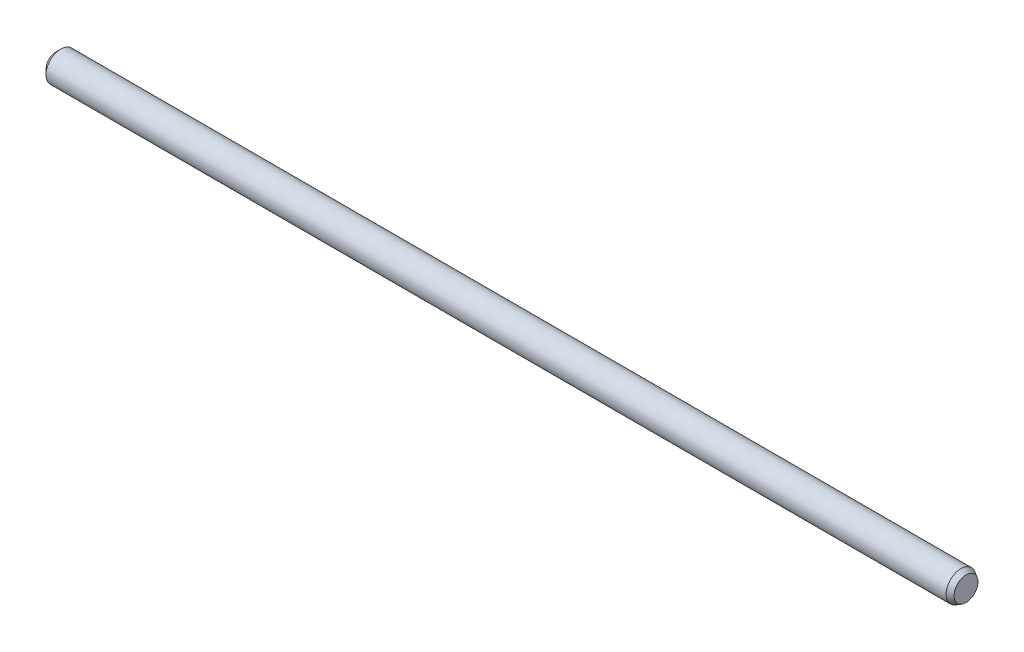
ISO-10303-21;
HEADER;
FILE_DESCRIPTION(('STEP AP214'),'2;1');
FILE_NAME('part.step','',(''),(''),'','','');
FILE_SCHEMA(('AUTOMOTIVE_DESIGN { 1 0 10303 214 1 1 1 1 }'));
ENDSEC;
DATA;
#1=APPLICATION_CONTEXT('core data for automotive mechanical design processes');
#2=APPLICATION_PROTOCOL_DEFINITION('international standard','automotive_design',2000,#1);
#3=PRODUCT_CONTEXT('',#1,'mechanical');
#4=PRODUCT('Part','Part','',(#3));
#5=PRODUCT_RELATED_PRODUCT_CATEGORY('part','',(#4));
#6=PRODUCT_DEFINITION_FORMATION('','',#4);
#7=PRODUCT_DEFINITION_CONTEXT('part definition',#1,'design');
#8=PRODUCT_DEFINITION('design','',#6,#7);
#9=PRODUCT_DEFINITION_SHAPE('','',#8);
#10=(LENGTH_UNIT() NAMED_UNIT(*) SI_UNIT(.MILLI.,.METRE.));
#11=(NAMED_UNIT(*) PLANE_ANGLE_UNIT() SI_UNIT($,.RADIAN.));
#12=(NAMED_UNIT(*) SI_UNIT($,.STERADIAN.) SOLID_ANGLE_UNIT());
#13=UNCERTAINTY_MEASURE_WITH_UNIT(LENGTH_MEASURE(1.E-05),#10,'distance_accuracy_value','');
#14=(GEOMETRIC_REPRESENTATION_CONTEXT(3) GLOBAL_UNCERTAINTY_ASSIGNED_CONTEXT((#13)) GLOBAL_UNIT_ASSIGNED_CONTEXT((#10,
#11,#12)) REPRESENTATION_CONTEXT('',''));
#15=CARTESIAN_POINT('',(0.,0.,0.));
#16=DIRECTION('',(0.,0.,1.));
#17=DIRECTION('',(1.,0.,0.));
#18=AXIS2_PLACEMENT_3D('',#15,#16,#17);
#19=CARTESIAN_POINT('',(90.,0.,0.));
#20=DIRECTION('',(-1.,0.,0.));
#21=DIRECTION('',(0.,0.,1.));
#22=AXIS2_PLACEMENT_3D('',#19,#20,#21);
#23=CYLINDRICAL_SURFACE('',#22,1.475);
#24=CARTESIAN_POINT('',(0.50000000000007,0.,0.));
#25=DIRECTION('',(1.,0.,0.));
#26=DIRECTION('',(0.,0.,-1.));
#27=AXIS2_PLACEMENT_3D('',#24,#25,#26);
#28=CIRCLE('',#27,1.475);
#29=CARTESIAN_POINT('',(0.50000000000007,0.,1.475));
#30=VERTEX_POINT('',#29);
#31=EDGE_CURVE('E40',#30,#30,#28,.T.);
#32=CARTESIAN_POINT('',(89.5,0.,0.));
#33=DIRECTION('',(1.,0.,0.));
#34=DIRECTION('',(0.,0.,-1.));
#35=AXIS2_PLACEMENT_3D('',#32,#33,#34);
#36=CIRCLE('',#35,1.475);
#37=CARTESIAN_POINT('',(89.5,0.,1.475));
#38=VERTEX_POINT('',#37);
#39=EDGE_CURVE('E44',#38,#38,#36,.F.);
#40=CARTESIAN_POINT('',(0.50000000000007,0.,1.475));
#41=CARTESIAN_POINT('',(1.4270833333334,0.,1.475));
#42=CARTESIAN_POINT('',(2.35416666666674,0.,1.475));
#43=CARTESIAN_POINT('',(4.2083333333334,0.,1.475));
#44=CARTESIAN_POINT('',(5.13541666666674,0.,1.475));
#45=CARTESIAN_POINT('',(6.9895833333334,0.,1.475));
#46=CARTESIAN_POINT('',(7.91666666666673,0.,1.475));
#47=CARTESIAN_POINT('',(9.7708333333334,0.,1.475));
#48=CARTESIAN_POINT('',(10.6979166666667,0.,1.475));
#49=CARTESIAN_POINT('',(12.5520833333334,0.,1.475));
#50=CARTESIAN_POINT('',(13.4791666666667,0.,1.475));
#51=CARTESIAN_POINT('',(15.3333333333334,0.,1.475));
#52=CARTESIAN_POINT('',(16.2604166666667,0.,1.475));
#53=CARTESIAN_POINT('',(18.1145833333334,0.,1.475));
#54=CARTESIAN_POINT('',(19.0416666666667,0.,1.475));
#55=CARTESIAN_POINT('',(20.8958333333334,0.,1.475));
#56=CARTESIAN_POINT('',(21.8229166666667,0.,1.475));
#57=CARTESIAN_POINT('',(23.6770833333334,0.,1.475));
#58=CARTESIAN_POINT('',(24.6041666666667,0.,1.475));
#59=CARTESIAN_POINT('',(26.4583333333334,0.,1.475));
#60=CARTESIAN_POINT('',(27.3854166666667,0.,1.475));
#61=CARTESIAN_POINT('',(29.2395833333334,0.,1.475));
#62=CARTESIAN_POINT('',(30.1666666666667,0.,1.475));
#63=CARTESIAN_POINT('',(32.0208333333334,0.,1.475));
#64=CARTESIAN_POINT('',(32.9479166666667,0.,1.475));
#65=CARTESIAN_POINT('',(34.8020833333334,0.,1.475));
#66=CARTESIAN_POINT('',(35.7291666666667,0.,1.475));
#67=CARTESIAN_POINT('',(37.5833333333334,0.,1.475));
#68=CARTESIAN_POINT('',(38.5104166666667,0.,1.475));
#69=CARTESIAN_POINT('',(40.3645833333334,0.,1.475));
#70=CARTESIAN_POINT('',(41.2916666666667,0.,1.475));
#71=CARTESIAN_POINT('',(43.1458333333334,0.,1.475));
#72=CARTESIAN_POINT('',(44.0729166666667,0.,1.475));
#73=CARTESIAN_POINT('',(45.9270833333334,0.,1.475));
#74=CARTESIAN_POINT('',(46.8541666666667,0.,1.475));
#75=CARTESIAN_POINT('',(48.7083333333334,0.,1.475));
#76=CARTESIAN_POINT('',(49.6354166666667,0.,1.475));
#77=CARTESIAN_POINT('',(51.4895833333334,0.,1.475));
#78=CARTESIAN_POINT('',(52.4166666666667,0.,1.475));
#79=CARTESIAN_POINT('',(54.2708333333334,0.,1.475));
#80=CARTESIAN_POINT('',(55.1979166666667,0.,1.475));
#81=CARTESIAN_POINT('',(57.0520833333334,0.,1.475));
#82=CARTESIAN_POINT('',(57.9791666666667,0.,1.475));
#83=CARTESIAN_POINT('',(59.8333333333334,0.,1.475));
#84=CARTESIAN_POINT('',(60.7604166666667,0.,1.475));
#85=CARTESIAN_POINT('',(62.6145833333334,0.,1.475));
#86=CARTESIAN_POINT('',(63.5416666666667,0.,1.475));
#87=CARTESIAN_POINT('',(65.3958333333334,0.,1.475));
#88=CARTESIAN_POINT('',(66.3229166666667,0.,1.475));
#89=CARTESIAN_POINT('',(68.1770833333334,0.,1.475));
#90=CARTESIAN_POINT('',(69.1041666666667,0.,1.475));
#91=CARTESIAN_POINT('',(70.9583333333334,0.,1.475));
#92=CARTESIAN_POINT('',(71.8854166666667,0.,1.475));
#93=CARTESIAN_POINT('',(73.7395833333334,0.,1.475));
#94=CARTESIAN_POINT('',(74.6666666666667,0.,1.475));
#95=CARTESIAN_POINT('',(76.5208333333334,0.,1.475));
#96=CARTESIAN_POINT('',(77.4479166666667,0.,1.475));
#97=CARTESIAN_POINT('',(79.3020833333334,0.,1.475));
#98=CARTESIAN_POINT('',(80.2291666666667,0.,1.475));
#99=CARTESIAN_POINT('',(82.0833333333334,0.,1.475));
#100=CARTESIAN_POINT('',(83.0104166666667,0.,1.475));
#101=CARTESIAN_POINT('',(84.8645833333334,0.,1.475));
#102=CARTESIAN_POINT('',(85.7916666666667,0.,1.475));
#103=CARTESIAN_POINT('',(87.6458333333334,0.,1.475));
#104=CARTESIAN_POINT('',(88.5729166666667,0.,1.475));
#105=CARTESIAN_POINT('',(89.5,0.,1.475));
#106=B_SPLINE_CURVE_WITH_KNOTS('',3,(#40,#41,#42,#43,#44,#45,#46,#47,#48,#49,#50,#51,#52,#53,
#54,#55,#56,#57,#58,#59,#60,#61,#62,#63,#64,#65,#66,#67,#68,#69,#70,#71,#72,#73,#74,#75,#76,#77,
#78,#79,#80,#81,#82,#83,#84,#85,#86,#87,#88,#89,#90,#91,#92,#93,#94,#95,#96,#97,#98,#99,#100,
#101,#102,#103,#104,#105),.UNSPECIFIED.,.F.,.F.,(4,2,2,2,2,2,2,2,2,2,2,2,2,2,2,2,2,2,2,2,2,2,2,
2,2,2,2,2,2,2,2,2,4),(0.,2.78125,5.5625,8.34375,11.125,13.90625,16.6875,19.46875,22.25,25.03125,
27.8125,30.59375,33.375,36.15625,38.9375,41.71875,44.5,47.28125,50.0625,52.84375,55.625,
58.40625,61.1875,63.96875,66.75,69.53125,72.3125,75.09375,77.875,80.65625,83.4375,86.21875,89.),.UNSPECIFIED.);
#107=EDGE_CURVE('BSEAM33',#30,#38,#106,.T.);
#108=ORIENTED_EDGE('',*,*,#31,.T.);
#109=ORIENTED_EDGE('',*,*,#39,.T.);
#110=ORIENTED_EDGE('',*,*,#107,.T.);
#111=ORIENTED_EDGE('',*,*,#107,.F.);
#112=EDGE_LOOP('',(#108,#110,#109,#111));
#113=FACE_BOUND('',#112,.T.);
#114=ADVANCED_FACE('F33',(#113),#23,.T.);
#115=CARTESIAN_POINT('',(90.,0.,0.));
#116=DIRECTION('',(1.,0.,0.));
#117=DIRECTION('',(0.,0.,-1.));
#118=AXIS2_PLACEMENT_3D('',#115,#116,#117);
#119=PLANE('',#118);
#120=CARTESIAN_POINT('',(90.,0.,0.));
#121=DIRECTION('',(1.,0.,0.));
#122=DIRECTION('',(0.,0.,-1.));
#123=AXIS2_PLACEMENT_3D('',#120,#121,#122);
#124=CIRCLE('',#123,1.18632486540521);
#125=CARTESIAN_POINT('',(90.,0.,-1.18632486540521));
#126=VERTEX_POINT('',#125);
#127=EDGE_CURVE('E48',#126,#126,#124,.T.);
#128=ORIENTED_EDGE('',*,*,#127,.T.);
#129=EDGE_LOOP('',(#128));
#130=FACE_BOUND('',#129,.T.);
#131=ADVANCED_FACE('F54',(#130),#119,.T.);
#132=CARTESIAN_POINT('',(0.,0.,0.));
#133=DIRECTION('',(1.,0.,0.));
#134=DIRECTION('',(0.,0.,-1.));
#135=AXIS2_PLACEMENT_3D('',#132,#133,#134);
#136=PLANE('',#135);
#137=CARTESIAN_POINT('',(0.,0.,0.));
#138=DIRECTION('',(1.,0.,0.));
#139=DIRECTION('',(0.,0.,-1.));
#140=AXIS2_PLACEMENT_3D('',#137,#138,#139);
#141=CIRCLE('',#140,0.97499999999992);
#142=CARTESIAN_POINT('',(0.,0.,-0.97499999999992));
#143=VERTEX_POINT('',#142);
#144=EDGE_CURVE('E10',#143,#143,#141,.F.);
#145=ORIENTED_EDGE('',*,*,#144,.T.);
#146=EDGE_LOOP('',(#145));
#147=FACE_BOUND('',#146,.T.);
#148=ADVANCED_FACE('F58',(#147),#136,.F.);
#149=CARTESIAN_POINT('',(90.,0.,0.));
#150=DIRECTION('',(-1.,0.,0.));
#151=DIRECTION('',(0.,0.,1.));
#152=AXIS2_PLACEMENT_3D('',#149,#150,#151);
#153=CONICAL_SURFACE('',#152,1.18632486540521,0.523598775598293);
#154=ORIENTED_EDGE('',*,*,#39,.F.);
#155=EDGE_LOOP('',(#154));
#156=FACE_BOUND('',#155,.T.);
#157=ORIENTED_EDGE('',*,*,#127,.F.);
#158=EDGE_LOOP('',(#157));
#159=FACE_BOUND('',#158,.T.);
#160=ADVANCED_FACE('F56',(#156,#159),#153,.T.);
#161=CARTESIAN_POINT('',(0.50000000000007,0.,0.));
#162=DIRECTION('',(1.,0.,0.));
#163=DIRECTION('',(0.,0.,-1.));
#164=AXIS2_PLACEMENT_3D('',#161,#162,#163);
#165=CONICAL_SURFACE('',#164,1.475,0.785398163397459);
#166=ORIENTED_EDGE('',*,*,#144,.F.);
#167=EDGE_LOOP('',(#166));
#168=FACE_BOUND('',#167,.T.);
#169=ORIENTED_EDGE('',*,*,#31,.F.);
#170=EDGE_LOOP('',(#169));
#171=FACE_BOUND('',#170,.T.);
#172=ADVANCED_FACE('F35',(#168,#171),#165,.T.);
#173=CLOSED_SHELL('',(#114,#131,#148,#160,#172));
#174=MANIFOLD_SOLID_BREP('B2',#173);
#175=ADVANCED_BREP_SHAPE_REPRESENTATION('',(#18,#174),#14);
#176=SHAPE_DEFINITION_REPRESENTATION(#9,#175);
ENDSEC;
END-ISO-10303-21;
